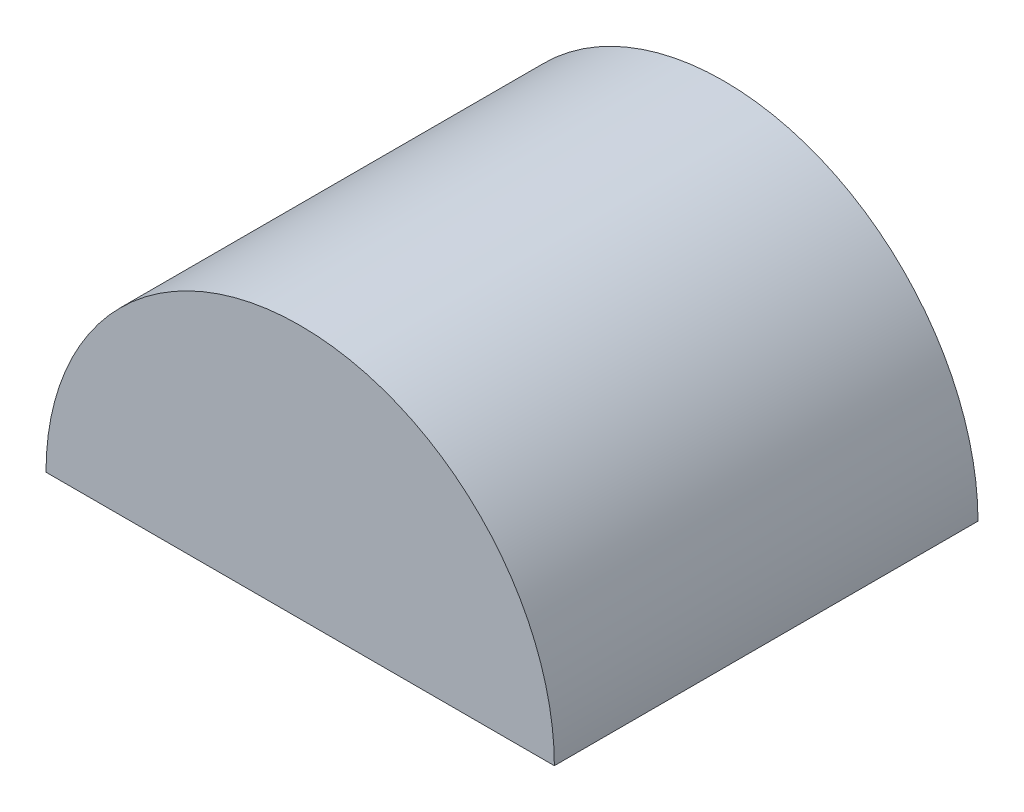
ISO-10303-21;
HEADER;
FILE_DESCRIPTION(('STEP AP214'),'2;1');
FILE_NAME('part.step','',(''),(''),'','','');
FILE_SCHEMA(('AUTOMOTIVE_DESIGN { 1 0 10303 214 1 1 1 1 }'));
ENDSEC;
DATA;
#1=APPLICATION_CONTEXT('core data for automotive mechanical design processes');
#2=APPLICATION_PROTOCOL_DEFINITION('international standard','automotive_design',2000,#1);
#3=PRODUCT_CONTEXT('',#1,'mechanical');
#4=PRODUCT('Part','Part','',(#3));
#5=PRODUCT_RELATED_PRODUCT_CATEGORY('part','',(#4));
#6=PRODUCT_DEFINITION_FORMATION('','',#4);
#7=PRODUCT_DEFINITION_CONTEXT('part definition',#1,'design');
#8=PRODUCT_DEFINITION('design','',#6,#7);
#9=PRODUCT_DEFINITION_SHAPE('','',#8);
#10=(LENGTH_UNIT() NAMED_UNIT(*) SI_UNIT(.MILLI.,.METRE.));
#11=(NAMED_UNIT(*) PLANE_ANGLE_UNIT() SI_UNIT($,.RADIAN.));
#12=(NAMED_UNIT(*) SI_UNIT($,.STERADIAN.) SOLID_ANGLE_UNIT());
#13=UNCERTAINTY_MEASURE_WITH_UNIT(LENGTH_MEASURE(1.E-05),#10,'distance_accuracy_value','');
#14=(GEOMETRIC_REPRESENTATION_CONTEXT(3) GLOBAL_UNCERTAINTY_ASSIGNED_CONTEXT((#13)) GLOBAL_UNIT_ASSIGNED_CONTEXT((#10,
#11,#12)) REPRESENTATION_CONTEXT('',''));
#15=CARTESIAN_POINT('',(0.,0.,0.));
#16=DIRECTION('',(0.,0.,1.));
#17=DIRECTION('',(1.,0.,0.));
#18=AXIS2_PLACEMENT_3D('',#15,#16,#17);
#19=CARTESIAN_POINT('',(0.,0.,500.));
#20=DIRECTION('',(0.,0.,-1.));
#21=DIRECTION('',(-1.,0.,0.));
#22=AXIS2_PLACEMENT_3D('',#19,#20,#21);
#23=CYLINDRICAL_SURFACE('',#22,300.);
#24=CARTESIAN_POINT('',(0.,0.,0.));
#25=DIRECTION('',(0.,0.,1.));
#26=DIRECTION('',(1.,0.,0.));
#27=AXIS2_PLACEMENT_3D('',#24,#25,#26);
#28=CIRCLE('',#27,300.);
#29=CARTESIAN_POINT('',(300.,0.,0.));
#30=VERTEX_POINT('',#29);
#31=CARTESIAN_POINT('',(-300.,0.,0.));
#32=VERTEX_POINT('',#31);
#33=EDGE_CURVE('E72',#30,#32,#28,.T.);
#34=ORIENTED_EDGE('',*,*,#33,.T.);
#35=DIRECTION('',(0.,0.,-1.));
#36=VECTOR('',#35,1.);
#37=CARTESIAN_POINT('',(-300.,0.,500.));
#38=LINE('',#37,#36);
#39=CARTESIAN_POINT('',(-300.,0.,500.));
#40=VERTEX_POINT('',#39);
#41=EDGE_CURVE('E11',#40,#32,#38,.T.);
#42=ORIENTED_EDGE('',*,*,#41,.F.);
#43=CARTESIAN_POINT('',(0.,0.,500.));
#44=DIRECTION('',(0.,0.,1.));
#45=DIRECTION('',(1.,0.,0.));
#46=AXIS2_PLACEMENT_3D('',#43,#44,#45);
#47=CIRCLE('',#46,300.);
#48=CARTESIAN_POINT('',(300.,0.,500.));
#49=VERTEX_POINT('',#48);
#50=EDGE_CURVE('E71',#49,#40,#47,.T.);
#51=ORIENTED_EDGE('',*,*,#50,.F.);
#52=DIRECTION('',(0.,0.,-1.));
#53=VECTOR('',#52,1.);
#54=CARTESIAN_POINT('',(300.,0.,500.));
#55=LINE('',#54,#53);
#56=EDGE_CURVE('E48',#49,#30,#55,.T.);
#57=ORIENTED_EDGE('',*,*,#56,.T.);
#58=EDGE_LOOP('',(#34,#42,#51,#57));
#59=FACE_BOUND('',#58,.T.);
#60=ADVANCED_FACE('F39',(#59),#23,.T.);
#61=CARTESIAN_POINT('',(-300.,0.,500.));
#62=DIRECTION('',(0.,1.,0.));
#63=DIRECTION('',(0.,0.,1.));
#64=AXIS2_PLACEMENT_3D('',#61,#62,#63);
#65=PLANE('',#64);
#66=DIRECTION('',(1.,0.,0.));
#67=VECTOR('',#66,1.);
#68=CARTESIAN_POINT('',(-300.,0.,0.));
#69=LINE('',#68,#67);
#70=EDGE_CURVE('E63',#32,#30,#69,.T.);
#71=ORIENTED_EDGE('',*,*,#70,.T.);
#72=ORIENTED_EDGE('',*,*,#56,.F.);
#73=DIRECTION('',(1.,0.,0.));
#74=VECTOR('',#73,1.);
#75=CARTESIAN_POINT('',(-300.,0.,500.));
#76=LINE('',#75,#74);
#77=EDGE_CURVE('E55',#40,#49,#76,.T.);
#78=ORIENTED_EDGE('',*,*,#77,.F.);
#79=ORIENTED_EDGE('',*,*,#41,.T.);
#80=EDGE_LOOP('',(#71,#72,#78,#79));
#81=FACE_BOUND('',#80,.T.);
#82=ADVANCED_FACE('F66',(#81),#65,.F.);
#83=CARTESIAN_POINT('',(0.,0.,500.));
#84=DIRECTION('',(0.,0.,1.));
#85=DIRECTION('',(1.,0.,0.));
#86=AXIS2_PLACEMENT_3D('',#83,#84,#85);
#87=PLANE('',#86);
#88=ORIENTED_EDGE('',*,*,#50,.T.);
#89=ORIENTED_EDGE('',*,*,#77,.T.);
#90=EDGE_LOOP('',(#88,#89));
#91=FACE_BOUND('',#90,.T.);
#92=ADVANCED_FACE('F83',(#91),#87,.T.);
#93=CARTESIAN_POINT('',(0.,0.,0.));
#94=DIRECTION('',(0.,0.,1.));
#95=DIRECTION('',(1.,0.,0.));
#96=AXIS2_PLACEMENT_3D('',#93,#94,#95);
#97=PLANE('',#96);
#98=ORIENTED_EDGE('',*,*,#33,.F.);
#99=ORIENTED_EDGE('',*,*,#70,.F.);
#100=EDGE_LOOP('',(#98,#99));
#101=FACE_BOUND('',#100,.T.);
#102=ADVANCED_FACE('F76',(#101),#97,.F.);
#103=CLOSED_SHELL('',(#60,#82,#92,#102));
#104=MANIFOLD_SOLID_BREP('B2',#103);
#105=ADVANCED_BREP_SHAPE_REPRESENTATION('',(#18,#104),#14);
#106=SHAPE_DEFINITION_REPRESENTATION(#9,#105);
ENDSEC;
END-ISO-10303-21;
